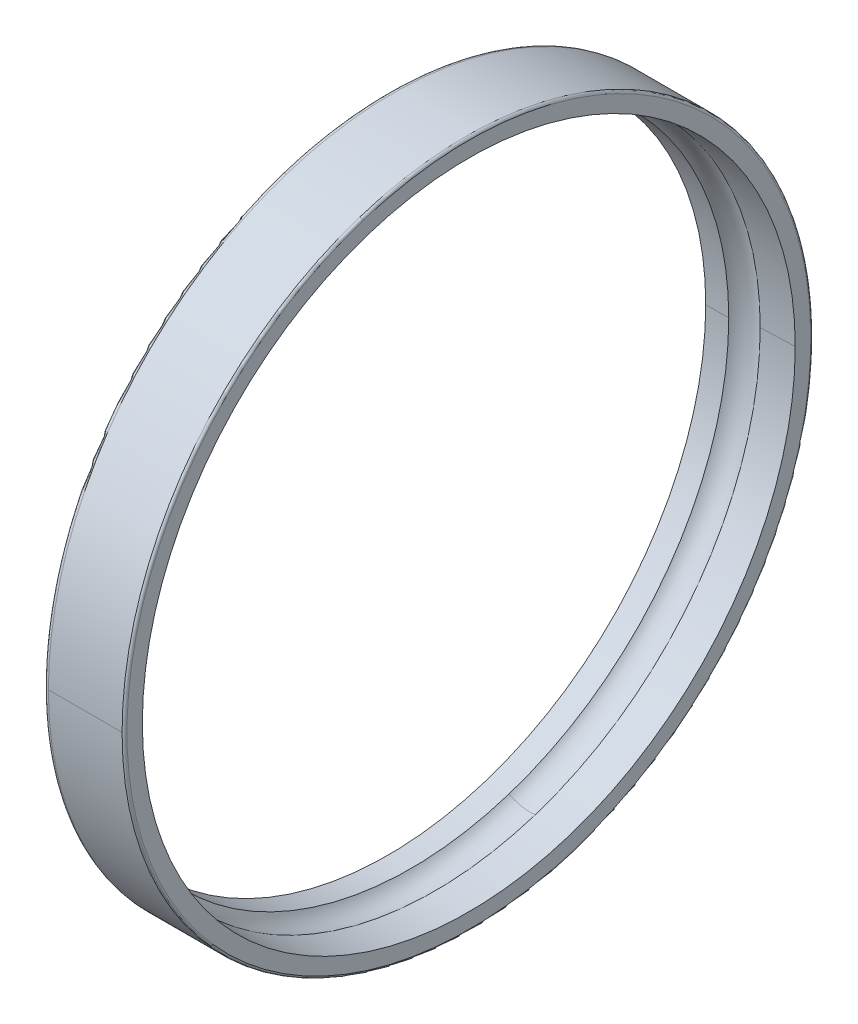
ISO-10303-21;
HEADER;
FILE_DESCRIPTION(('STEP AP214'),'2;1');
FILE_NAME('part.step','',(''),(''),'','','');
FILE_SCHEMA(('AUTOMOTIVE_DESIGN { 1 0 10303 214 1 1 1 1 }'));
ENDSEC;
DATA;
#1=APPLICATION_CONTEXT('core data for automotive mechanical design processes');
#2=APPLICATION_PROTOCOL_DEFINITION('international standard','automotive_design',2000,#1);
#3=PRODUCT_CONTEXT('',#1,'mechanical');
#4=PRODUCT('Part','Part','',(#3));
#5=PRODUCT_RELATED_PRODUCT_CATEGORY('part','',(#4));
#6=PRODUCT_DEFINITION_FORMATION('','',#4);
#7=PRODUCT_DEFINITION_CONTEXT('part definition',#1,'design');
#8=PRODUCT_DEFINITION('design','',#6,#7);
#9=PRODUCT_DEFINITION_SHAPE('','',#8);
#10=(LENGTH_UNIT() NAMED_UNIT(*) SI_UNIT(.MILLI.,.METRE.));
#11=(NAMED_UNIT(*) PLANE_ANGLE_UNIT() SI_UNIT($,.RADIAN.));
#12=(NAMED_UNIT(*) SI_UNIT($,.STERADIAN.) SOLID_ANGLE_UNIT());
#13=UNCERTAINTY_MEASURE_WITH_UNIT(LENGTH_MEASURE(1.E-05),#10,'distance_accuracy_value','');
#14=(GEOMETRIC_REPRESENTATION_CONTEXT(3) GLOBAL_UNCERTAINTY_ASSIGNED_CONTEXT((#13)) GLOBAL_UNIT_ASSIGNED_CONTEXT((#10,
#11,#12)) REPRESENTATION_CONTEXT('',''));
#15=CARTESIAN_POINT('',(0.,0.,0.));
#16=DIRECTION('',(0.,0.,1.));
#17=DIRECTION('',(1.,0.,0.));
#18=AXIS2_PLACEMENT_3D('',#15,#16,#17);
#19=CARTESIAN_POINT('',(0.599999999999885,0.,0.));
#20=DIRECTION('',(1.,0.,0.));
#21=DIRECTION('',(0.,-0.309016994374947,0.951056516295154));
#22=AXIS2_PLACEMENT_3D('',#19,#20,#21);
#23=TOROIDAL_SURFACE('',#22,41.9,0.599999999999885);
#24=CARTESIAN_POINT('',(0.599999999999885,-39.8492680327669,-12.9478120643103));
#25=DIRECTION('',(0.,0.309016994374947,-0.951056516295154));
#26=DIRECTION('',(1.90403248723249E-13,-0.951056516295154,-0.309016994374947));
#27=AXIS2_PLACEMENT_3D('',#24,#25,#26);
#28=CIRCLE('',#27,0.59999999999989);
#29=CARTESIAN_POINT('',(0.599999999999999,-40.4199019425439,-13.1332222609352));
#30=VERTEX_POINT('',#29);
#31=CARTESIAN_POINT('',(0.,-39.8492680327669,-12.9478120643103));
#32=VERTEX_POINT('',#31);
#33=EDGE_CURVE('E11',#30,#32,#28,.T.);
#34=ORIENTED_EDGE('',*,*,#33,.T.);
#35=CARTESIAN_POINT('',(0.,-39.8492680327669,-12.9478120643104));
#36=CARTESIAN_POINT('',(0.,-39.6374235705722,-13.5998493402492));
#37=CARTESIAN_POINT('',(0.,-39.4095490446918,-14.2466768316133));
#38=CARTESIAN_POINT('',(0.,-38.922348592519,-15.5283766956858));
#39=CARTESIAN_POINT('',(0.,-38.6630226662267,-16.1632490683942));
#40=CARTESIAN_POINT('',(0.,-38.1135281401892,-17.4195031456491));
#41=CARTESIAN_POINT('',(0.,-37.8233595404442,-18.0408848501956));
#42=CARTESIAN_POINT('',(0.,-37.2128829994526,-19.2686622590068));
#43=CARTESIAN_POINT('',(0.,-36.8925750582061,-19.8750579632716));
#44=CARTESIAN_POINT('',(0.,-36.2225903344942,-21.0714020741734));
#45=CARTESIAN_POINT('',(0.,-35.8729135520289,-21.6613504808105));
#46=CARTESIAN_POINT('',(0.,-35.1450338559118,-22.8233788761606));
#47=CARTESIAN_POINT('',(0.,-34.7668309422601,-23.3954588648735));
#48=CARTESIAN_POINT('',(0.,-33.9828100251779,-24.5203722022005));
#49=CARTESIAN_POINT('',(0.,-33.5769920217475,-25.0732055508145));
#50=CARTESIAN_POINT('',(0.,-32.7387185983397,-26.1582937923908));
#51=CARTESIAN_POINT('',(0.,-32.3062631783624,-26.6905486853531));
#52=CARTESIAN_POINT('',(0.,-31.4157567389201,-27.7331977647164));
#53=CARTESIAN_POINT('',(0.,-30.9577057194552,-28.2435919511173));
#54=CARTESIAN_POINT('',(0.,-30.0171115676521,-29.241290033661));
#55=CARTESIAN_POINT('',(0.,-29.5345684353139,-29.7285939298038));
#56=CARTESIAN_POINT('',(0.,-28.5461525460103,-30.6789374739009));
#57=CARTESIAN_POINT('',(0.,-28.040279789045,-31.1419771218553));
#58=CARTESIAN_POINT('',(0.,-27.0064233423818,-32.0426766665495));
#59=CARTESIAN_POINT('',(0.,-26.4784396526841,-32.4803365632893));
#60=CARTESIAN_POINT('',(0.,-25.40163329948,-33.3292222445172));
#61=CARTESIAN_POINT('',(0.,-24.8528106359736,-33.7404480290052));
#62=CARTESIAN_POINT('',(0.,-23.7356484970281,-34.5354748067985));
#63=CARTESIAN_POINT('',(0.,-23.167309021589,-34.9192758001038));
#64=CARTESIAN_POINT('',(0.,-22.0124824383527,-35.6585283853211));
#65=CARTESIAN_POINT('',(0.,-21.4259953305556,-36.013979977233));
#66=CARTESIAN_POINT('',(0.,-20.2362863814168,-36.6956774456449));
#67=CARTESIAN_POINT('',(0.,-19.6330645400751,-37.0219233221448));
#68=CARTESIAN_POINT('',(0.,-18.4113393380988,-37.6444234048405));
#69=CARTESIAN_POINT('',(0.,-17.7928359774643,-37.9406776110361));
#70=CARTESIAN_POINT('',(0.,-16.5420377656725,-38.5024806507917));
#71=CARTESIAN_POINT('',(0.,-15.9097429145153,-38.7680294843516));
#72=CARTESIAN_POINT('',(0.,-14.6328849753573,-39.2677820484362));
#73=CARTESIAN_POINT('',(0.,-13.9883218873565,-39.5019857789609));
#74=CARTESIAN_POINT('',(0.,-12.6884802834471,-39.9384839196745));
#75=CARTESIAN_POINT('',(0.,-12.0332017675387,-40.1407783298634));
#76=CARTESIAN_POINT('',(0.,-10.7135079311545,-40.5129704849523));
#77=CARTESIAN_POINT('',(0.,-10.0490926106788,-40.6828682298523));
#78=CARTESIAN_POINT('',(0.,-8.71272579986327,-40.9898577558147));
#79=CARTESIAN_POINT('',(0.,-8.04077430952336,-41.1269495368771));
#80=CARTESIAN_POINT('',(0.,-6.69095394897551,-41.3679968690558));
#81=CARTESIAN_POINT('',(0.,-6.01308507876758,-41.4719524201722));
#82=CARTESIAN_POINT('',(0.,-4.65306300396632,-41.6464768544308));
#83=CARTESIAN_POINT('',(0.,-3.970909799373,-41.7170457375731));
#84=CARTESIAN_POINT('',(0.,-2.60396242262038,-41.824626829263));
#85=CARTESIAN_POINT('',(0.,-1.91916825046109,-41.8616390378106));
#86=CARTESIAN_POINT('',(0.,-0.548588667718171,-41.9020176146588));
#87=CARTESIAN_POINT('',(0.,0.13719674286545,-41.9053839829594));
#88=CARTESIAN_POINT('',(0.,1.50810668533523,-41.8784627694376));
#89=CARTESIAN_POINT('',(0.,2.1932312172214,-41.8481751876152));
#90=CARTESIAN_POINT('',(0.,3.56116887728913,-41.7540190392847));
#91=CARTESIAN_POINT('',(0.,4.2439820054707,-41.6901504727767));
#92=CARTESIAN_POINT('',(0.,5.60565190149609,-41.5289862200461));
#93=CARTESIAN_POINT('',(0.,6.28450866933991,-41.4316905338235));
#94=CARTESIAN_POINT('',(0.,7.63663041927523,-41.2039064354938));
#95=CARTESIAN_POINT('',(0.,8.30989540136673,-41.0734180233867));
#96=CARTESIAN_POINT('',(0.,9.64921162548452,-40.7795628313024));
#97=CARTESIAN_POINT('',(0.,10.3152628675108,-40.6161960513251));
#98=CARTESIAN_POINT('',(0.,11.6385470357169,-40.2569776883826));
#99=CARTESIAN_POINT('',(0.,12.2957799618967,-40.0611261054173));
#100=CARTESIAN_POINT('',(0.,13.5998441667239,-39.6374099601166));
#101=CARTESIAN_POINT('',(0.,14.2466754453713,-39.4095453977812));
#102=CARTESIAN_POINT('',(0.,15.5283780819276,-38.9223522394297));
#103=CARTESIAN_POINT('',(0.,16.1632494398365,-38.6630236434135));
#104=CARTESIAN_POINT('',(0.,17.4195027742066,-38.1135271630025));
#105=CARTESIAN_POINT('',(0.,18.0408847506678,-37.8233592786078));
#106=CARTESIAN_POINT('',(0.,19.2686623585344,-37.212883261289));
#107=CARTESIAN_POINT('',(0.,19.8750579899398,-36.892575128365));
#108=CARTESIAN_POINT('',(0.,21.0714020475049,-36.2225902643355));
#109=CARTESIAN_POINT('',(0.,21.6613504736646,-35.87291353323));
#110=CARTESIAN_POINT('',(0.,22.8233788833062,-35.1450338747109));
#111=CARTESIAN_POINT('',(0.,23.3954588667881,-34.7668309472973));
#112=CARTESIAN_POINT('',(0.,24.5203722002857,-33.9828100201408));
#113=CARTESIAN_POINT('',(0.,25.0732055503014,-33.5769920203979));
#114=CARTESIAN_POINT('',(0.,26.1582937929038,-32.7387185996895));
#115=CARTESIAN_POINT('',(0.,26.6905486854905,-32.3062631787241));
#116=CARTESIAN_POINT('',(0.,27.7331977645788,-31.4157567385585));
#117=CARTESIAN_POINT('',(0.,28.2435919510804,-30.9577057193584));
#118=CARTESIAN_POINT('',(0.,29.2412900336977,-30.0171115677491));
#119=CARTESIAN_POINT('',(0.,29.7285939298136,-29.5345684353399));
#120=CARTESIAN_POINT('',(0.,30.678937473891,-28.5461525459844));
#121=CARTESIAN_POINT('',(0.,31.1419771218526,-28.0402797890381));
#122=CARTESIAN_POINT('',(0.,32.042676666552,-27.0064233423889));
#123=CARTESIAN_POINT('',(0.,32.48033656329,-26.478439652686));
#124=CARTESIAN_POINT('',(0.,33.3292222445164,-25.4016332994782));
#125=CARTESIAN_POINT('',(0.,33.7404480290049,-24.8528106359732));
#126=CARTESIAN_POINT('',(0.,34.5354748067986,-23.7356484970287));
#127=CARTESIAN_POINT('',(0.,34.9192758001038,-23.1673090215892));
#128=CARTESIAN_POINT('',(0.,35.6585283853209,-22.0124824383527));
#129=CARTESIAN_POINT('',(0.,36.0139799772329,-21.4259953305557));
#130=CARTESIAN_POINT('',(0.,36.6956774456448,-20.2362863814169));
#131=CARTESIAN_POINT('',(0.,37.0219233221448,-19.6330645400752));
#132=CARTESIAN_POINT('',(0.,37.6444234048404,-18.411339338099));
#133=CARTESIAN_POINT('',(0.,37.940677611036,-17.7928359774644));
#134=CARTESIAN_POINT('',(0.,38.5024806507917,-16.5420377656726));
#135=CARTESIAN_POINT('',(0.,38.7680294843517,-15.9097429145154));
#136=CARTESIAN_POINT('',(0.,39.267782048436,-14.6328849753575));
#137=CARTESIAN_POINT('',(0.,39.5019857789604,-13.9883218873567));
#138=CARTESIAN_POINT('',(0.,39.938483919675,-12.6884802834471));
#139=CARTESIAN_POINT('',(0.,40.1407783298653,-12.0332017675382));
#140=CARTESIAN_POINT('',(0.,40.5129704849503,-10.7135079311551));
#141=CARTESIAN_POINT('',(0.,40.6828682298451,-10.0490926106809));
#142=CARTESIAN_POINT('',(0.,40.9898577558219,-8.71272579986143));
#143=CARTESIAN_POINT('',(0.,41.1269495369039,-8.04077430951619));
#144=CARTESIAN_POINT('',(0.,41.367996869029,-6.6909539489829));
#145=CARTESIAN_POINT('',(0.,41.4719524200721,-6.01308507879485));
#146=CARTESIAN_POINT('',(0.,41.6464768545309,-4.65306300393928));
#147=CARTESIAN_POINT('',(0.,41.7170457379465,-3.97090979927175));
#148=CARTESIAN_POINT('',(0.,41.8246268288896,-2.60396242272187));
#149=CARTESIAN_POINT('',(0.,41.8616390364171,-1.9191682508395));
#150=CARTESIAN_POINT('',(0.,41.9020176160523,-0.548588667340038));
#151=CARTESIAN_POINT('',(0.,41.90538398816,0.137196744277061));
#152=CARTESIAN_POINT('',(0.,41.878462764237,1.50810668392335));
#153=CARTESIAN_POINT('',(0.,41.8481751682063,2.19323121195253));
#154=CARTESIAN_POINT('',(0.,41.7540190586936,3.56116888255775));
#155=CARTESIAN_POINT('',(0.,41.6901505452117,4.24398202513377));
#156=CARTESIAN_POINT('',(0.,41.5289861476111,5.60565188183281));
#157=CARTESIAN_POINT('',(0.,41.4316902634925,6.28450859595583));
#158=CARTESIAN_POINT('',(0.,41.2039067058248,7.63663049265911));
#159=CARTESIAN_POINT('',(0.,41.0734190322758,8.30989567523938));
#160=CARTESIAN_POINT('',(0.,40.7795618224134,9.64921135161166));
#161=CARTESIAN_POINT('',(0.,40.6161922861,10.3152618454037));
#162=CARTESIAN_POINT('',(0.,40.2569814536078,11.6385480578238));
#163=CARTESIAN_POINT('',(0.,40.061140157429,12.2957837764519));
#164=CARTESIAN_POINT('',(0.,39.849268032767,12.9478120643102));
#165=B_SPLINE_CURVE_WITH_KNOTS('',3,(#35,#36,#37,#38,#39,#40,#41,#42,#43,#44,#45,#46,#47,#48,
#49,#50,#51,#52,#53,#54,#55,#56,#57,#58,#59,#60,#61,#62,#63,#64,#65,#66,#67,#68,#69,#70,#71,#72,
#73,#74,#75,#76,#77,#78,#79,#80,#81,#82,#83,#84,#85,#86,#87,#88,#89,#90,#91,#92,#93,#94,#95,#96,
#97,#98,#99,#100,#101,#102,#103,#104,#105,#106,#107,#108,#109,#110,#111,#112,#113,#114,#115,
#116,#117,#118,#119,#120,#121,#122,#123,#124,#125,#126,#127,#128,#129,#130,#131,#132,#133,#134,
#135,#136,#137,#138,#139,#140,#141,#142,#143,#144,#145,#146,#147,#148,#149,#150,#151,#152,#153,
#154,#155,#156,#157,#158,#159,#160,#161,#162,#163,#164),.UNSPECIFIED.,.F.,.F.,(4,2,2,2,2,2,2,2,
2,2,2,2,2,2,2,2,2,2,2,2,2,2,2,2,2,2,2,2,2,2,2,2,2,2,2,2,2,2,2,2,2,2,2,2,2,2,2,2,2,2,2,2,2,2,2,2,
2,2,2,2,2,2,2,2,4),(0.,2.05655495022004,4.1131099004401,6.16966485066013,8.22621980088019,
10.2827747511002,12.3393297013203,14.3958846515403,16.4524396017604,18.5089945519804,
20.5655495022005,22.6221044524205,24.6786594026406,26.7352143528606,28.7917693030806,
30.8483242533007,32.9048792035207,34.9614341537408,37.0179891039608,39.0745440541809,
41.1310990044009,43.187653954621,45.244208904841,47.3007638550611,49.3573188052811,
51.4138737555012,53.4704287057212,55.5269836559413,57.5835386061613,59.6400935563813,
61.6966485066014,63.7532034568214,65.8097584070415,67.8663133572615,69.9228683074816,
71.9794232577017,74.0359782079217,76.0925331581417,78.1490881083618,80.2056430585818,
82.2621980088019,84.3187529590219,86.3753079092419,88.431862859462,90.488417809682,
92.5449727599021,94.6015277101221,96.6580826603421,98.7146376105622,100.771192560782,
102.827747511002,104.884302461222,106.940857411442,108.997412361662,111.053967311883,
113.110522262103,115.167077212323,117.223632162543,119.280187112763,121.336742062983,
123.393297013203,125.449851963423,127.506406913643,129.562961863863,131.619516814083),.UNSPECIFIED.);
#166=CARTESIAN_POINT('',(0.,39.8492680327669,12.9478120643103));
#167=VERTEX_POINT('',#166);
#168=EDGE_CURVE('E26',#32,#167,#165,.T.);
#169=ORIENTED_EDGE('',*,*,#168,.T.);
#170=CARTESIAN_POINT('',(0.599999999999885,39.8492680327669,12.9478120643103));
#171=DIRECTION('',(0.,-0.309016994374947,0.951056516295154));
#172=DIRECTION('',(1.92068583260187E-13,0.951056516295154,0.309016994374947));
#173=AXIS2_PLACEMENT_3D('',#170,#171,#172);
#174=CIRCLE('',#173,0.59999999999989);
#175=CARTESIAN_POINT('',(0.6,40.4199019425439,13.1332222609352));
#176=VERTEX_POINT('',#175);
#177=EDGE_CURVE('E299',#176,#167,#174,.T.);
#178=ORIENTED_EDGE('',*,*,#177,.F.);
#179=CARTESIAN_POINT('',(0.6,0.,0.));
#180=DIRECTION('',(1.,0.,0.));
#181=DIRECTION('',(0.,0.,-1.));
#182=AXIS2_PLACEMENT_3D('',#179,#180,#181);
#183=CIRCLE('',#182,42.5);
#184=CARTESIAN_POINT('',(0.6,0.,-42.5));
#185=VERTEX_POINT('',#184);
#186=EDGE_CURVE('E294',#185,#176,#183,.T.);
#187=ORIENTED_EDGE('',*,*,#186,.F.);
#188=CARTESIAN_POINT('',(0.6,0.,0.));
#189=DIRECTION('',(1.,0.,0.));
#190=DIRECTION('',(0.,0.,-1.));
#191=AXIS2_PLACEMENT_3D('',#188,#189,#190);
#192=CIRCLE('',#191,42.5);
#193=EDGE_CURVE('E289',#30,#185,#192,.T.);
#194=ORIENTED_EDGE('',*,*,#193,.F.);
#195=EDGE_LOOP('',(#34,#169,#178,#187,#194));
#196=FACE_BOUND('',#195,.T.);
#197=ADVANCED_FACE('F17',(#196),#23,.T.);
#198=CARTESIAN_POINT('',(50.,0.,0.));
#199=DIRECTION('',(1.,0.,0.));
#200=DIRECTION('',(0.,1.,0.));
#201=AXIS2_PLACEMENT_3D('',#198,#199,#200);
#202=CYLINDRICAL_SURFACE('',#201,42.5);
#203=DIRECTION('',(1.,0.,0.));
#204=VECTOR('',#203,1.);
#205=CARTESIAN_POINT('',(0.600000000000001,0.,42.5));
#206=LINE('',#205,#204);
#207=CARTESIAN_POINT('',(0.600000000000001,0.,42.5));
#208=VERTEX_POINT('',#207);
#209=CARTESIAN_POINT('',(9.7,0.,42.5));
#210=VERTEX_POINT('',#209);
#211=EDGE_CURVE('E284',#208,#210,#206,.T.);
#212=ORIENTED_EDGE('',*,*,#211,.F.);
#213=CARTESIAN_POINT('',(0.6,0.,0.));
#214=DIRECTION('',(1.,0.,0.));
#215=DIRECTION('',(0.,0.,-1.));
#216=AXIS2_PLACEMENT_3D('',#213,#214,#215);
#217=CIRCLE('',#216,42.5);
#218=EDGE_CURVE('E279',#208,#30,#217,.T.);
#219=ORIENTED_EDGE('',*,*,#218,.T.);
#220=ORIENTED_EDGE('',*,*,#193,.T.);
#221=DIRECTION('',(1.,0.,0.));
#222=VECTOR('',#221,1.);
#223=CARTESIAN_POINT('',(0.600000000000001,0.,-42.5));
#224=LINE('',#223,#222);
#225=CARTESIAN_POINT('',(9.7,0.,-42.5));
#226=VERTEX_POINT('',#225);
#227=EDGE_CURVE('E275',#185,#226,#224,.T.);
#228=ORIENTED_EDGE('',*,*,#227,.T.);
#229=CARTESIAN_POINT('',(9.7,0.,0.));
#230=DIRECTION('',(1.,0.,0.));
#231=DIRECTION('',(0.,0.,-1.));
#232=AXIS2_PLACEMENT_3D('',#229,#230,#231);
#233=CIRCLE('',#232,42.5);
#234=CARTESIAN_POINT('',(9.7,-40.4199019425439,-13.1332222609352));
#235=VERTEX_POINT('',#234);
#236=EDGE_CURVE('E270',#235,#226,#233,.T.);
#237=ORIENTED_EDGE('',*,*,#236,.F.);
#238=CARTESIAN_POINT('',(9.7,0.,0.));
#239=DIRECTION('',(1.,0.,0.));
#240=DIRECTION('',(0.,0.,-1.));
#241=AXIS2_PLACEMENT_3D('',#238,#239,#240);
#242=CIRCLE('',#241,42.5);
#243=EDGE_CURVE('E265',#210,#235,#242,.T.);
#244=ORIENTED_EDGE('',*,*,#243,.F.);
#245=EDGE_LOOP('',(#212,#219,#220,#228,#237,#244));
#246=FACE_BOUND('',#245,.T.);
#247=ADVANCED_FACE('F320',(#246),#202,.T.);
#248=CARTESIAN_POINT('',(9.70000000000012,0.,0.));
#249=DIRECTION('',(1.,0.,0.));
#250=DIRECTION('',(0.,0.309016994374947,-0.951056516295154));
#251=AXIS2_PLACEMENT_3D('',#248,#249,#250);
#252=TOROIDAL_SURFACE('',#251,42.2,0.29999999999988);
#253=CARTESIAN_POINT('',(9.70000000000012,-40.1345849876555,-13.0405171626228));
#254=DIRECTION('',(0.,0.309016994374947,-0.951056516295154));
#255=DIRECTION('',(1.,0.,0.));
#256=AXIS2_PLACEMENT_3D('',#253,#254,#255);
#257=CIRCLE('',#256,0.29999999999988);
#258=CARTESIAN_POINT('',(10.,-40.1345849876555,-13.0405171626228));
#259=VERTEX_POINT('',#258);
#260=EDGE_CURVE('E260',#259,#235,#257,.T.);
#261=ORIENTED_EDGE('',*,*,#260,.F.);
#262=CARTESIAN_POINT('',(10.,0.,0.));
#263=DIRECTION('',(1.,0.,0.));
#264=DIRECTION('',(0.,0.,-1.));
#265=AXIS2_PLACEMENT_3D('',#262,#263,#264);
#266=CIRCLE('',#265,42.2);
#267=CARTESIAN_POINT('',(10.,40.1345849876555,13.0405171626228));
#268=VERTEX_POINT('',#267);
#269=EDGE_CURVE('E255',#268,#259,#266,.T.);
#270=ORIENTED_EDGE('',*,*,#269,.F.);
#271=CARTESIAN_POINT('',(9.70000000000012,40.1345849876555,13.0405171626228));
#272=DIRECTION('',(0.,-0.309016994374947,0.951056516295154));
#273=DIRECTION('',(1.,0.,0.));
#274=AXIS2_PLACEMENT_3D('',#271,#272,#273);
#275=CIRCLE('',#274,0.29999999999988);
#276=CARTESIAN_POINT('',(9.7,40.4199019425439,13.1332222609352));
#277=VERTEX_POINT('',#276);
#278=EDGE_CURVE('E251',#268,#277,#275,.T.);
#279=ORIENTED_EDGE('',*,*,#278,.T.);
#280=CARTESIAN_POINT('',(9.7,0.,0.));
#281=DIRECTION('',(1.,0.,0.));
#282=DIRECTION('',(0.,0.,-1.));
#283=AXIS2_PLACEMENT_3D('',#280,#281,#282);
#284=CIRCLE('',#283,42.5);
#285=EDGE_CURVE('E246',#277,#210,#284,.T.);
#286=ORIENTED_EDGE('',*,*,#285,.T.);
#287=ORIENTED_EDGE('',*,*,#243,.T.);
#288=EDGE_LOOP('',(#261,#270,#279,#286,#287));
#289=FACE_BOUND('',#288,.T.);
#290=ADVANCED_FACE('F322',(#289),#252,.T.);
#291=CARTESIAN_POINT('',(50.,0.,0.));
#292=DIRECTION('',(1.,0.,0.));
#293=DIRECTION('',(0.,-1.,0.));
#294=AXIS2_PLACEMENT_3D('',#291,#292,#293);
#295=CYLINDRICAL_SURFACE('',#294,42.5);
#296=ORIENTED_EDGE('',*,*,#211,.T.);
#297=ORIENTED_EDGE('',*,*,#285,.F.);
#298=CARTESIAN_POINT('',(9.7,0.,0.));
#299=DIRECTION('',(1.,0.,0.));
#300=DIRECTION('',(0.,0.,-1.));
#301=AXIS2_PLACEMENT_3D('',#298,#299,#300);
#302=CIRCLE('',#301,42.5);
#303=EDGE_CURVE('E241',#226,#277,#302,.T.);
#304=ORIENTED_EDGE('',*,*,#303,.F.);
#305=ORIENTED_EDGE('',*,*,#227,.F.);
#306=ORIENTED_EDGE('',*,*,#186,.T.);
#307=CARTESIAN_POINT('',(0.6,0.,0.));
#308=DIRECTION('',(1.,0.,0.));
#309=DIRECTION('',(0.,0.,-1.));
#310=AXIS2_PLACEMENT_3D('',#307,#308,#309);
#311=CIRCLE('',#310,42.5);
#312=EDGE_CURVE('E238',#176,#208,#311,.T.);
#313=ORIENTED_EDGE('',*,*,#312,.T.);
#314=EDGE_LOOP('',(#296,#297,#304,#305,#306,#313));
#315=FACE_BOUND('',#314,.T.);
#316=ADVANCED_FACE('F316',(#315),#295,.T.);
#317=CARTESIAN_POINT('',(0.599999999999885,0.,0.));
#318=DIRECTION('',(1.,0.,0.));
#319=DIRECTION('',(0.,0.309016994374947,-0.951056516295154));
#320=AXIS2_PLACEMENT_3D('',#317,#318,#319);
#321=TOROIDAL_SURFACE('',#320,41.9,0.599999999999885);
#322=ORIENTED_EDGE('',*,*,#33,.F.);
#323=ORIENTED_EDGE('',*,*,#218,.F.);
#324=ORIENTED_EDGE('',*,*,#312,.F.);
#325=ORIENTED_EDGE('',*,*,#177,.T.);
#326=CARTESIAN_POINT('',(0.,39.8492680327669,12.9478120643104));
#327=CARTESIAN_POINT('',(0.,39.6374235705722,13.5998493402492));
#328=CARTESIAN_POINT('',(0.,39.4095490446918,14.2466768316133));
#329=CARTESIAN_POINT('',(0.,38.922348592519,15.5283766956858));
#330=CARTESIAN_POINT('',(0.,38.6630226662267,16.1632490683943));
#331=CARTESIAN_POINT('',(0.,38.1135281401892,17.4195031456491));
#332=CARTESIAN_POINT('',(0.,37.8233595404442,18.0408848501956));
#333=CARTESIAN_POINT('',(0.,37.2128829994526,19.2686622590068));
#334=CARTESIAN_POINT('',(0.,36.8925750582061,19.8750579632716));
#335=CARTESIAN_POINT('',(0.,36.2225903344942,21.0714020741734));
#336=CARTESIAN_POINT('',(0.,35.8729135520289,21.6613504808105));
#337=CARTESIAN_POINT('',(0.,35.1450338559118,22.8233788761606));
#338=CARTESIAN_POINT('',(0.,34.76683094226,23.3954588648736));
#339=CARTESIAN_POINT('',(0.,33.9828100251779,24.5203722022005));
#340=CARTESIAN_POINT('',(0.,33.5769920217475,25.0732055508145));
#341=CARTESIAN_POINT('',(0.,32.7387185983397,26.1582937923908));
#342=CARTESIAN_POINT('',(0.,32.3062631783624,26.6905486853532));
#343=CARTESIAN_POINT('',(0.,31.4157567389201,27.7331977647164));
#344=CARTESIAN_POINT('',(0.,30.9577057194552,28.2435919511173));
#345=CARTESIAN_POINT('',(0.,30.0171115676521,29.241290033661));
#346=CARTESIAN_POINT('',(0.,29.5345684353139,29.7285939298038));
#347=CARTESIAN_POINT('',(0.,28.5461525460103,30.6789374739009));
#348=CARTESIAN_POINT('',(0.,28.0402797890449,31.1419771218553));
#349=CARTESIAN_POINT('',(0.,27.0064233423818,32.0426766665495));
#350=CARTESIAN_POINT('',(0.,26.478439652684,32.4803365632893));
#351=CARTESIAN_POINT('',(0.,25.4016332994799,33.3292222445172));
#352=CARTESIAN_POINT('',(0.,24.8528106359736,33.7404480290052));
#353=CARTESIAN_POINT('',(0.,23.7356484970281,34.5354748067985));
#354=CARTESIAN_POINT('',(0.,23.167309021589,34.9192758001038));
#355=CARTESIAN_POINT('',(0.,22.0124824383527,35.6585283853211));
#356=CARTESIAN_POINT('',(0.,21.4259953305556,36.013979977233));
#357=CARTESIAN_POINT('',(0.,20.2362863814167,36.6956774456449));
#358=CARTESIAN_POINT('',(0.,19.6330645400751,37.0219233221448));
#359=CARTESIAN_POINT('',(0.,18.4113393380988,37.6444234048405));
#360=CARTESIAN_POINT('',(0.,17.7928359774642,37.9406776110362));
#361=CARTESIAN_POINT('',(0.,16.5420377656725,38.5024806507917));
#362=CARTESIAN_POINT('',(0.,15.9097429145153,38.7680294843516));
#363=CARTESIAN_POINT('',(0.,14.6328849753573,39.2677820484362));
#364=CARTESIAN_POINT('',(0.,13.9883218873564,39.5019857789609));
#365=CARTESIAN_POINT('',(0.,12.6884802834471,39.9384839196745));
#366=CARTESIAN_POINT('',(0.,12.0332017675386,40.1407783298634));
#367=CARTESIAN_POINT('',(0.,10.7135079311545,40.5129704849523));
#368=CARTESIAN_POINT('',(0.,10.0490926106788,40.6828682298523));
#369=CARTESIAN_POINT('',(0.,8.71272579986322,40.9898577558147));
#370=CARTESIAN_POINT('',(0.,8.0407743095233,41.1269495368771));
#371=CARTESIAN_POINT('',(0.,6.69095394897545,41.3679968690559));
#372=CARTESIAN_POINT('',(0.,6.01308507876752,41.4719524201722));
#373=CARTESIAN_POINT('',(0.,4.65306300396626,41.6464768544309));
#374=CARTESIAN_POINT('',(0.,3.97090979937294,41.7170457375731));
#375=CARTESIAN_POINT('',(0.,2.60396242262033,41.824626829263));
#376=CARTESIAN_POINT('',(0.,1.91916825046104,41.8616390378106));
#377=CARTESIAN_POINT('',(0.,0.548588667718122,41.9020176146588));
#378=CARTESIAN_POINT('',(0.,-0.137196742865504,41.9053839829594));
#379=CARTESIAN_POINT('',(0.,-1.50810668533529,41.8784627694376));
#380=CARTESIAN_POINT('',(0.,-2.19323121722146,41.8481751876152));
#381=CARTESIAN_POINT('',(0.,-3.5611688772892,41.7540190392847));
#382=CARTESIAN_POINT('',(0.,-4.24398200547077,41.6901504727767));
#383=CARTESIAN_POINT('',(0.,-5.60565190149617,41.5289862200461));
#384=CARTESIAN_POINT('',(0.,-6.28450866933998,41.4316905338234));
#385=CARTESIAN_POINT('',(0.,-7.63663041927531,41.2039064354937));
#386=CARTESIAN_POINT('',(0.,-8.30989540136681,41.0734180233867));
#387=CARTESIAN_POINT('',(0.,-9.64921162548459,40.7795628313024));
#388=CARTESIAN_POINT('',(0.,-10.3152628675109,40.6161960513251));
#389=CARTESIAN_POINT('',(0.,-11.638547035717,40.2569776883825));
#390=CARTESIAN_POINT('',(0.,-12.2957799618968,40.0611261054172));
#391=CARTESIAN_POINT('',(0.,-13.599844166724,39.6374099601166));
#392=CARTESIAN_POINT('',(0.,-14.2466754453713,39.4095453977812));
#393=CARTESIAN_POINT('',(0.,-15.5283780819277,38.9223522394296));
#394=CARTESIAN_POINT('',(0.,-16.1632494398366,38.6630236434134));
#395=CARTESIAN_POINT('',(0.,-17.4195027742067,38.1135271630025));
#396=CARTESIAN_POINT('',(0.,-18.0408847506679,37.8233592786078));
#397=CARTESIAN_POINT('',(0.,-19.2686623585345,37.212883261289));
#398=CARTESIAN_POINT('',(0.,-19.8750579899399,36.8925751283649));
#399=CARTESIAN_POINT('',(0.,-21.071402047505,36.2225902643354));
#400=CARTESIAN_POINT('',(0.,-21.6613504736647,35.8729135332299));
#401=CARTESIAN_POINT('',(0.,-22.8233788833063,35.1450338747109));
#402=CARTESIAN_POINT('',(0.,-23.3954588667882,34.7668309472973));
#403=CARTESIAN_POINT('',(0.,-24.5203722002858,33.9828100201407));
#404=CARTESIAN_POINT('',(0.,-25.0732055503015,33.5769920203978));
#405=CARTESIAN_POINT('',(0.,-26.1582937929039,32.7387185996895));
#406=CARTESIAN_POINT('',(0.,-26.6905486854906,32.3062631787241));
#407=CARTESIAN_POINT('',(0.,-27.7331977645789,31.4157567385585));
#408=CARTESIAN_POINT('',(0.,-28.2435919510804,30.9577057193583));
#409=CARTESIAN_POINT('',(0.,-29.2412900336978,30.017111567749));
#410=CARTESIAN_POINT('',(0.,-29.7285939298136,29.5345684353399));
#411=CARTESIAN_POINT('',(0.,-30.678937473891,28.5461525459844));
#412=CARTESIAN_POINT('',(0.,-31.1419771218526,28.040279789038));
#413=CARTESIAN_POINT('',(0.,-32.0426766665521,27.0064233423888));
#414=CARTESIAN_POINT('',(0.,-32.48033656329,26.4784396526859));
#415=CARTESIAN_POINT('',(0.,-33.3292222445165,25.4016332994781));
#416=CARTESIAN_POINT('',(0.,-33.740448029005,24.8528106359731));
#417=CARTESIAN_POINT('',(0.,-34.5354748067987,23.7356484970286));
#418=CARTESIAN_POINT('',(0.,-34.9192758001039,23.1673090215891));
#419=CARTESIAN_POINT('',(0.,-35.658528385321,22.0124824383526));
#420=CARTESIAN_POINT('',(0.,-36.013979977233,21.4259953305556));
#421=CARTESIAN_POINT('',(0.,-36.6956774456449,20.2362863814168));
#422=CARTESIAN_POINT('',(0.,-37.0219233221448,19.6330645400751));
#423=CARTESIAN_POINT('',(0.,-37.6444234048404,18.4113393380988));
#424=CARTESIAN_POINT('',(0.,-37.9406776110361,17.7928359774643));
#425=CARTESIAN_POINT('',(0.,-38.5024806507917,16.5420377656725));
#426=CARTESIAN_POINT('',(0.,-38.7680294843517,15.9097429145153));
#427=CARTESIAN_POINT('',(0.,-39.2677820484361,14.6328849753573));
#428=CARTESIAN_POINT('',(0.,-39.5019857789604,13.9883218873566));
#429=CARTESIAN_POINT('',(0.,-39.938483919675,12.688480283447));
#430=CARTESIAN_POINT('',(0.,-40.1407783298653,12.0332017675381));
#431=CARTESIAN_POINT('',(0.,-40.5129704849504,10.713507931155));
#432=CARTESIAN_POINT('',(0.,-40.6828682298451,10.0490926106808));
#433=CARTESIAN_POINT('',(0.,-40.9898577558219,8.71272579986132));
#434=CARTESIAN_POINT('',(0.,-41.1269495369039,8.04077430951608));
#435=CARTESIAN_POINT('',(0.,-41.367996869029,6.69095394898277));
#436=CARTESIAN_POINT('',(0.,-41.4719524200722,6.01308507879471));
#437=CARTESIAN_POINT('',(0.,-41.6464768545309,4.65306300393912));
#438=CARTESIAN_POINT('',(0.,-41.7170457379465,3.9709097992716));
#439=CARTESIAN_POINT('',(0.,-41.8246268288896,2.60396242272171));
#440=CARTESIAN_POINT('',(0.,-41.8616390364171,1.91916825083935));
#441=CARTESIAN_POINT('',(0.,-41.9020176160523,0.548588667339885));
#442=CARTESIAN_POINT('',(0.,-41.90538398816,-0.137196744277215));
#443=CARTESIAN_POINT('',(0.,-41.878462764237,-1.5081066839235));
#444=CARTESIAN_POINT('',(0.,-41.8481751682063,-2.19323121195269));
#445=CARTESIAN_POINT('',(0.,-41.7540190586936,-3.5611688825579));
#446=CARTESIAN_POINT('',(0.,-41.6901505452117,-4.24398202513393));
#447=CARTESIAN_POINT('',(0.,-41.5289861476111,-5.60565188183297));
#448=CARTESIAN_POINT('',(0.,-41.4316902634924,-6.28450859595598));
#449=CARTESIAN_POINT('',(0.,-41.2039067058248,-7.63663049265926));
#450=CARTESIAN_POINT('',(0.,-41.0734190322758,-8.30989567523953));
#451=CARTESIAN_POINT('',(0.,-40.7795618224133,-9.64921135161181));
#452=CARTESIAN_POINT('',(0.,-40.6161922860999,-10.3152618454038));
#453=CARTESIAN_POINT('',(0.,-40.2569814536077,-11.6385480578239));
#454=CARTESIAN_POINT('',(0.,-40.0611401574289,-12.295783776452));
#455=CARTESIAN_POINT('',(0.,-39.8492680327669,-12.9478120643103));
#456=B_SPLINE_CURVE_WITH_KNOTS('',3,(#326,#327,#328,#329,#330,#331,#332,#333,#334,#335,#336,
#337,#338,#339,#340,#341,#342,#343,#344,#345,#346,#347,#348,#349,#350,#351,#352,#353,#354,#355,
#356,#357,#358,#359,#360,#361,#362,#363,#364,#365,#366,#367,#368,#369,#370,#371,#372,#373,#374,
#375,#376,#377,#378,#379,#380,#381,#382,#383,#384,#385,#386,#387,#388,#389,#390,#391,#392,#393,
#394,#395,#396,#397,#398,#399,#400,#401,#402,#403,#404,#405,#406,#407,#408,#409,#410,#411,#412,
#413,#414,#415,#416,#417,#418,#419,#420,#421,#422,#423,#424,#425,#426,#427,#428,#429,#430,#431,
#432,#433,#434,#435,#436,#437,#438,#439,#440,#441,#442,#443,#444,#445,#446,#447,#448,#449,#450,
#451,#452,#453,#454,#455),.UNSPECIFIED.,.F.,.F.,(4,2,2,2,2,2,2,2,2,2,2,2,2,2,2,2,2,2,2,2,2,2,2,
2,2,2,2,2,2,2,2,2,2,2,2,2,2,2,2,2,2,2,2,2,2,2,2,2,2,2,2,2,2,2,2,2,2,2,2,2,2,2,2,2,4),(0.,
2.05655495022004,4.1131099004401,6.16966485066015,8.2262198008802,10.2827747511002,
12.3393297013203,14.3958846515403,16.4524396017604,18.5089945519804,20.5655495022005,
22.6221044524205,24.6786594026406,26.7352143528606,28.7917693030807,30.8483242533007,
32.9048792035208,34.9614341537408,37.0179891039609,39.0745440541809,41.131099004401,
43.187653954621,45.2442089048411,47.3007638550611,49.3573188052812,51.4138737555012,
53.4704287057213,55.5269836559413,57.5835386061614,59.6400935563814,61.6966485066015,
63.7532034568215,65.8097584070415,67.8663133572616,69.9228683074816,71.9794232577017,
74.0359782079217,76.0925331581418,78.1490881083618,80.2056430585819,82.2621980088019,
84.318752959022,86.375307909242,88.4318628594621,90.4884178096821,92.5449727599022,
94.6015277101222,96.6580826603423,98.7146376105623,100.771192560782,102.827747511002,
104.884302461222,106.940857411443,108.997412361663,111.053967311883,113.110522262103,
115.167077212323,117.223632162543,119.280187112763,121.336742062983,123.393297013203,
125.449851963423,127.506406913643,129.562961863863,131.619516814083),.UNSPECIFIED.);
#457=EDGE_CURVE('E224',#167,#32,#456,.T.);
#458=ORIENTED_EDGE('',*,*,#457,.T.);
#459=EDGE_LOOP('',(#322,#323,#324,#325,#458));
#460=FACE_BOUND('',#459,.T.);
#461=ADVANCED_FACE('F203',(#460),#321,.T.);
#462=CARTESIAN_POINT('',(0.,41.9,0.));
#463=DIRECTION('',(-1.,0.,0.));
#464=DIRECTION('',(0.,0.,1.));
#465=AXIS2_PLACEMENT_3D('',#462,#463,#464);
#466=PLANE('',#465);
#467=CARTESIAN_POINT('',(0.,0.,0.));
#468=DIRECTION('',(1.,0.,0.));
#469=DIRECTION('',(0.,0.,-1.));
#470=AXIS2_PLACEMENT_3D('',#467,#468,#469);
#471=CIRCLE('',#470,39.25);
#472=CARTESIAN_POINT('',(0.,0.,-39.25));
#473=VERTEX_POINT('',#472);
#474=CARTESIAN_POINT('',(0.,0.,39.25));
#475=VERTEX_POINT('',#474);
#476=EDGE_CURVE('E220',#473,#475,#471,.T.);
#477=ORIENTED_EDGE('',*,*,#476,.T.);
#478=CARTESIAN_POINT('',(0.,0.,0.));
#479=DIRECTION('',(1.,0.,0.));
#480=DIRECTION('',(0.,0.,-1.));
#481=AXIS2_PLACEMENT_3D('',#478,#479,#480);
#482=CIRCLE('',#481,39.25);
#483=EDGE_CURVE('E184',#475,#473,#482,.T.);
#484=ORIENTED_EDGE('',*,*,#483,.T.);
#485=EDGE_LOOP('',(#477,#484));
#486=FACE_BOUND('',#485,.T.);
#487=ORIENTED_EDGE('',*,*,#168,.F.);
#488=ORIENTED_EDGE('',*,*,#457,.F.);
#489=EDGE_LOOP('',(#487,#488));
#490=FACE_BOUND('',#489,.T.);
#491=ADVANCED_FACE('F192',(#486,#490),#466,.T.);
#492=CARTESIAN_POINT('',(50.,0.,0.));
#493=DIRECTION('',(1.,0.,0.));
#494=DIRECTION('',(0.,1.,0.));
#495=AXIS2_PLACEMENT_3D('',#492,#493,#494);
#496=CYLINDRICAL_SURFACE('',#495,39.25);
#497=DIRECTION('',(1.,0.,0.));
#498=VECTOR('',#497,1.);
#499=CARTESIAN_POINT('',(0.,0.,39.25));
#500=LINE('',#499,#498);
#501=CARTESIAN_POINT('',(2.8425051564372,0.,39.25));
#502=VERTEX_POINT('',#501);
#503=EDGE_CURVE('E180',#475,#502,#500,.T.);
#504=ORIENTED_EDGE('',*,*,#503,.T.);
#505=CARTESIAN_POINT('',(2.8425051564372,0.,0.));
#506=DIRECTION('',(1.,0.,0.));
#507=DIRECTION('',(0.,0.,-1.));
#508=AXIS2_PLACEMENT_3D('',#505,#506,#507);
#509=CIRCLE('',#508,39.25);
#510=CARTESIAN_POINT('',(2.8425051564372,-37.3289682645848,-12.1289170292167));
#511=VERTEX_POINT('',#510);
#512=EDGE_CURVE('E176',#502,#511,#509,.T.);
#513=ORIENTED_EDGE('',*,*,#512,.T.);
#514=CARTESIAN_POINT('',(2.8425051564372,0.,0.));
#515=DIRECTION('',(1.,0.,0.));
#516=DIRECTION('',(0.,0.,-1.));
#517=AXIS2_PLACEMENT_3D('',#514,#515,#516);
#518=CIRCLE('',#517,39.25);
#519=CARTESIAN_POINT('',(2.8425051564372,0.,-39.25));
#520=VERTEX_POINT('',#519);
#521=EDGE_CURVE('E172',#511,#520,#518,.T.);
#522=ORIENTED_EDGE('',*,*,#521,.T.);
#523=DIRECTION('',(1.,0.,0.));
#524=VECTOR('',#523,1.);
#525=CARTESIAN_POINT('',(0.,0.,-39.25));
#526=LINE('',#525,#524);
#527=EDGE_CURVE('E167',#473,#520,#526,.T.);
#528=ORIENTED_EDGE('',*,*,#527,.F.);
#529=ORIENTED_EDGE('',*,*,#483,.F.);
#530=EDGE_LOOP('',(#504,#513,#522,#528,#529));
#531=FACE_BOUND('',#530,.T.);
#532=ADVANCED_FACE('F202',(#531),#496,.F.);
#533=CARTESIAN_POINT('',(50.,0.,0.));
#534=DIRECTION('',(1.,0.,0.));
#535=DIRECTION('',(0.,-1.,0.));
#536=AXIS2_PLACEMENT_3D('',#533,#534,#535);
#537=CYLINDRICAL_SURFACE('',#536,39.25);
#538=ORIENTED_EDGE('',*,*,#503,.F.);
#539=ORIENTED_EDGE('',*,*,#476,.F.);
#540=ORIENTED_EDGE('',*,*,#527,.T.);
#541=CARTESIAN_POINT('',(2.8425051564372,0.,0.));
#542=DIRECTION('',(1.,0.,0.));
#543=DIRECTION('',(0.,0.,-1.));
#544=AXIS2_PLACEMENT_3D('',#541,#542,#543);
#545=CIRCLE('',#544,39.25);
#546=CARTESIAN_POINT('',(2.8425051564372,37.3289682645848,12.1289170292167));
#547=VERTEX_POINT('',#546);
#548=EDGE_CURVE('E163',#520,#547,#545,.T.);
#549=ORIENTED_EDGE('',*,*,#548,.T.);
#550=CARTESIAN_POINT('',(2.8425051564372,0.,0.));
#551=DIRECTION('',(1.,0.,0.));
#552=DIRECTION('',(0.,0.,-1.));
#553=AXIS2_PLACEMENT_3D('',#550,#551,#552);
#554=CIRCLE('',#553,39.25);
#555=EDGE_CURVE('E158',#547,#502,#554,.T.);
#556=ORIENTED_EDGE('',*,*,#555,.T.);
#557=EDGE_LOOP('',(#538,#539,#540,#549,#556));
#558=FACE_BOUND('',#557,.T.);
#559=ADVANCED_FACE('F376',(#558),#537,.F.);
#560=CARTESIAN_POINT('',(5.00000000000029,0.,0.));
#561=DIRECTION('',(1.,0.,0.));
#562=DIRECTION('',(0.,0.309016994374947,-0.951056516295154));
#563=AXIS2_PLACEMENT_3D('',#560,#561,#562);
#564=TOROIDAL_SURFACE('',#563,37.4999999999986,2.77800000000112);
#565=CARTESIAN_POINT('',(5.00000000000029,-35.6646193610669,-11.5881372890601));
#566=DIRECTION('',(0.,0.309016994374947,-0.951056516295154));
#567=DIRECTION('',(0.295374020244771,-0.908621989079172,-0.295229180682144));
#568=AXIS2_PLACEMENT_3D('',#565,#566,#567);
#569=CIRCLE('',#568,2.77800000000111);
#570=CARTESIAN_POINT('',(5.82054902824059,-38.1887712467299,-12.4082839529954));
#571=VERTEX_POINT('',#570);
#572=EDGE_CURVE('E130',#571,#511,#569,.T.);
#573=ORIENTED_EDGE('',*,*,#572,.T.);
#574=ORIENTED_EDGE('',*,*,#512,.F.);
#575=ORIENTED_EDGE('',*,*,#555,.F.);
#576=CARTESIAN_POINT('',(5.00000000000029,35.6646193610669,11.5881372890601));
#577=DIRECTION('',(0.,-0.309016994374948,0.951056516295154));
#578=DIRECTION('',(0.295374020244771,0.908621989079172,0.295229180682144));
#579=AXIS2_PLACEMENT_3D('',#576,#577,#578);
#580=CIRCLE('',#579,2.77800000000111);
#581=CARTESIAN_POINT('',(5.82054902824059,38.1887712467299,12.4082839529954));
#582=VERTEX_POINT('',#581);
#583=EDGE_CURVE('E151',#582,#547,#580,.T.);
#584=ORIENTED_EDGE('',*,*,#583,.F.);
#585=CARTESIAN_POINT('',(5.8205490282406,0.,0.));
#586=DIRECTION('',(1.,0.,0.));
#587=DIRECTION('',(0.,0.,-1.));
#588=AXIS2_PLACEMENT_3D('',#585,#586,#587);
#589=CIRCLE('',#588,40.154050356013);
#590=CARTESIAN_POINT('',(5.82054902824083,0.,40.154050356013));
#591=VERTEX_POINT('',#590);
#592=EDGE_CURVE('E122',#582,#591,#589,.T.);
#593=ORIENTED_EDGE('',*,*,#592,.T.);
#594=CARTESIAN_POINT('',(5.8205490282406,0.,0.));
#595=DIRECTION('',(1.,0.,0.));
#596=DIRECTION('',(0.,0.,-1.));
#597=AXIS2_PLACEMENT_3D('',#594,#595,#596);
#598=CIRCLE('',#597,40.154050356013);
#599=EDGE_CURVE('E144',#591,#571,#598,.T.);
#600=ORIENTED_EDGE('',*,*,#599,.T.);
#601=EDGE_LOOP('',(#573,#574,#575,#584,#593,#600));
#602=FACE_BOUND('',#601,.T.);
#603=ADVANCED_FACE('F383',(#602),#564,.F.);
#604=CARTESIAN_POINT('',(5.8205490282406,0.,0.));
#605=DIRECTION('',(1.,0.,0.));
#606=DIRECTION('',(0.,1.,0.));
#607=AXIS2_PLACEMENT_3D('',#604,#605,#606);
#608=CONICAL_SURFACE('',#607,40.154050356013,0.0349065850399178);
#609=DIRECTION('',(0.999390827019095,0.,0.0348994967025319));
#610=VECTOR('',#609,1.);
#611=CARTESIAN_POINT('',(5.82054902824083,0.,40.154050356013));
#612=LINE('',#611,#610);
#613=CARTESIAN_POINT('',(10.0000000000001,0.,40.3));
#614=VERTEX_POINT('',#613);
#615=EDGE_CURVE('E140',#591,#614,#612,.T.);
#616=ORIENTED_EDGE('',*,*,#615,.T.);
#617=CARTESIAN_POINT('',(10.,0.,0.));
#618=DIRECTION('',(1.,0.,0.));
#619=DIRECTION('',(0.,0.,-1.));
#620=AXIS2_PLACEMENT_3D('',#617,#618,#619);
#621=CIRCLE('',#620,40.3);
#622=CARTESIAN_POINT('',(10.,0.,-40.3));
#623=VERTEX_POINT('',#622);
#624=EDGE_CURVE('E112',#614,#623,#621,.T.);
#625=ORIENTED_EDGE('',*,*,#624,.T.);
#626=DIRECTION('',(0.999390827019095,0.,-0.0348994967025319));
#627=VECTOR('',#626,1.);
#628=CARTESIAN_POINT('',(5.82054902824083,0.,-40.154050356013));
#629=LINE('',#628,#627);
#630=CARTESIAN_POINT('',(5.8205490282406,0.,-40.154050356013));
#631=VERTEX_POINT('',#630);
#632=EDGE_CURVE('E104',#631,#623,#629,.T.);
#633=ORIENTED_EDGE('',*,*,#632,.F.);
#634=CARTESIAN_POINT('',(5.8205490282406,0.,0.));
#635=DIRECTION('',(1.,0.,0.));
#636=DIRECTION('',(0.,0.,-1.));
#637=AXIS2_PLACEMENT_3D('',#634,#635,#636);
#638=CIRCLE('',#637,40.154050356013);
#639=EDGE_CURVE('E109',#571,#631,#638,.T.);
#640=ORIENTED_EDGE('',*,*,#639,.F.);
#641=ORIENTED_EDGE('',*,*,#599,.F.);
#642=EDGE_LOOP('',(#616,#625,#633,#640,#641));
#643=FACE_BOUND('',#642,.T.);
#644=ADVANCED_FACE('F106',(#643),#608,.F.);
#645=CARTESIAN_POINT('',(5.00000000000029,0.,0.));
#646=DIRECTION('',(1.,0.,0.));
#647=DIRECTION('',(0.,-0.309016994374947,0.951056516295154));
#648=AXIS2_PLACEMENT_3D('',#645,#646,#647);
#649=TOROIDAL_SURFACE('',#648,37.4999999999986,2.77800000000112);
#650=ORIENTED_EDGE('',*,*,#572,.F.);
#651=ORIENTED_EDGE('',*,*,#639,.T.);
#652=CARTESIAN_POINT('',(5.8205490282406,0.,0.));
#653=DIRECTION('',(1.,0.,0.));
#654=DIRECTION('',(0.,0.,-1.));
#655=AXIS2_PLACEMENT_3D('',#652,#653,#654);
#656=CIRCLE('',#655,40.154050356013);
#657=EDGE_CURVE('E119',#631,#582,#656,.T.);
#658=ORIENTED_EDGE('',*,*,#657,.T.);
#659=ORIENTED_EDGE('',*,*,#583,.T.);
#660=ORIENTED_EDGE('',*,*,#548,.F.);
#661=ORIENTED_EDGE('',*,*,#521,.F.);
#662=EDGE_LOOP('',(#650,#651,#658,#659,#660,#661));
#663=FACE_BOUND('',#662,.T.);
#664=ADVANCED_FACE('F127',(#663),#649,.F.);
#665=CARTESIAN_POINT('',(5.8205490282406,0.,0.));
#666=DIRECTION('',(1.,0.,0.));
#667=DIRECTION('',(0.,-1.,0.));
#668=AXIS2_PLACEMENT_3D('',#665,#666,#667);
#669=CONICAL_SURFACE('',#668,40.154050356013,0.0349065850399178);
#670=ORIENTED_EDGE('',*,*,#615,.F.);
#671=ORIENTED_EDGE('',*,*,#592,.F.);
#672=ORIENTED_EDGE('',*,*,#657,.F.);
#673=ORIENTED_EDGE('',*,*,#632,.T.);
#674=CARTESIAN_POINT('',(10.,0.,0.));
#675=DIRECTION('',(1.,0.,0.));
#676=DIRECTION('',(0.,0.,-1.));
#677=AXIS2_PLACEMENT_3D('',#674,#675,#676);
#678=CIRCLE('',#677,40.3);
#679=EDGE_CURVE('E125',#623,#614,#678,.T.);
#680=ORIENTED_EDGE('',*,*,#679,.T.);
#681=EDGE_LOOP('',(#670,#671,#672,#673,#680));
#682=FACE_BOUND('',#681,.T.);
#683=ADVANCED_FACE('F121',(#682),#669,.F.);
#684=CARTESIAN_POINT('',(10.,40.3,0.));
#685=DIRECTION('',(1.,0.,0.));
#686=DIRECTION('',(0.,0.,-1.));
#687=AXIS2_PLACEMENT_3D('',#684,#685,#686);
#688=PLANE('',#687);
#689=ORIENTED_EDGE('',*,*,#269,.T.);
#690=CARTESIAN_POINT('',(10.,-40.1345849876555,-13.0405171626228));
#691=CARTESIAN_POINT('',(10.,-38.086102143705,-19.3447840424402));
#692=CARTESIAN_POINT('',(10.,-34.8002892277532,-25.2472145792892));
#693=CARTESIAN_POINT('',(10.,-30.3801977148151,-30.4221979054107));
#694=CARTESIAN_POINT('',(10.,-19.7491760951657,-38.759925691716));
#695=CARTESIAN_POINT('',(10.,-6.7550464508891,-42.4598519941538));
#696=CARTESIAN_POINT('',(10.,0.029700241556796,-42.9938347089844));
#697=CARTESIAN_POINT('',(10.,13.4426272138247,-41.3721524723726));
#698=CARTESIAN_POINT('',(10.,25.2471139812848,-34.8002002968924));
#699=CARTESIAN_POINT('',(10.,30.4222221932461,-30.3802251595322));
#700=CARTESIAN_POINT('',(10.,38.7599317874353,-19.749164131643));
#701=CARTESIAN_POINT('',(10.,42.4598155148796,-6.7550429332174));
#702=CARTESIAN_POINT('',(10.,42.9939657855855,0.0296711283099889));
#703=CARTESIAN_POINT('',(10.,42.1828826526866,6.7361901145271));
#704=CARTESIAN_POINT('',(10.,40.1345849876555,13.0405171626228));
#705=B_SPLINE_CURVE_WITH_KNOTS('',5,(#690,#691,#692,#693,#694,#695,#696,#697,#698,#699,#700,
#701,#702,#703,#704),.UNSPECIFIED.,.F.,.F.,(6,3,3,3,6),(0.,0.785398163397448,1.5707963267949,
2.35619449019234,3.14159265358979),.UNSPECIFIED.);
#706=EDGE_CURVE('E328',#259,#268,#705,.T.);
#707=ORIENTED_EDGE('',*,*,#706,.T.);
#708=EDGE_LOOP('',(#689,#707));
#709=FACE_BOUND('',#708,.T.);
#710=ORIENTED_EDGE('',*,*,#624,.F.);
#711=ORIENTED_EDGE('',*,*,#679,.F.);
#712=EDGE_LOOP('',(#710,#711));
#713=FACE_BOUND('',#712,.T.);
#714=ADVANCED_FACE('F331',(#709,#713),#688,.T.);
#715=CARTESIAN_POINT('',(9.70000000000012,0.,0.));
#716=DIRECTION('',(1.,0.,0.));
#717=DIRECTION('',(0.,-0.309016994374947,0.951056516295154));
#718=AXIS2_PLACEMENT_3D('',#715,#716,#717);
#719=TOROIDAL_SURFACE('',#718,42.2,0.29999999999988);
#720=ORIENTED_EDGE('',*,*,#260,.T.);
#721=ORIENTED_EDGE('',*,*,#236,.T.);
#722=ORIENTED_EDGE('',*,*,#303,.T.);
#723=ORIENTED_EDGE('',*,*,#278,.F.);
#724=ORIENTED_EDGE('',*,*,#706,.F.);
#725=EDGE_LOOP('',(#720,#721,#722,#723,#724));
#726=FACE_BOUND('',#725,.T.);
#727=ADVANCED_FACE('F327',(#726),#719,.T.);
#728=CLOSED_SHELL('',(#197,#247,#290,#316,#461,#491,#532,#559,#603,#644,#664,#683,#714,#727));
#729=MANIFOLD_SOLID_BREP('B1',#728);
#730=ADVANCED_BREP_SHAPE_REPRESENTATION('',(#18,#729),#14);
#731=SHAPE_DEFINITION_REPRESENTATION(#9,#730);
ENDSEC;
END-ISO-10303-21;
